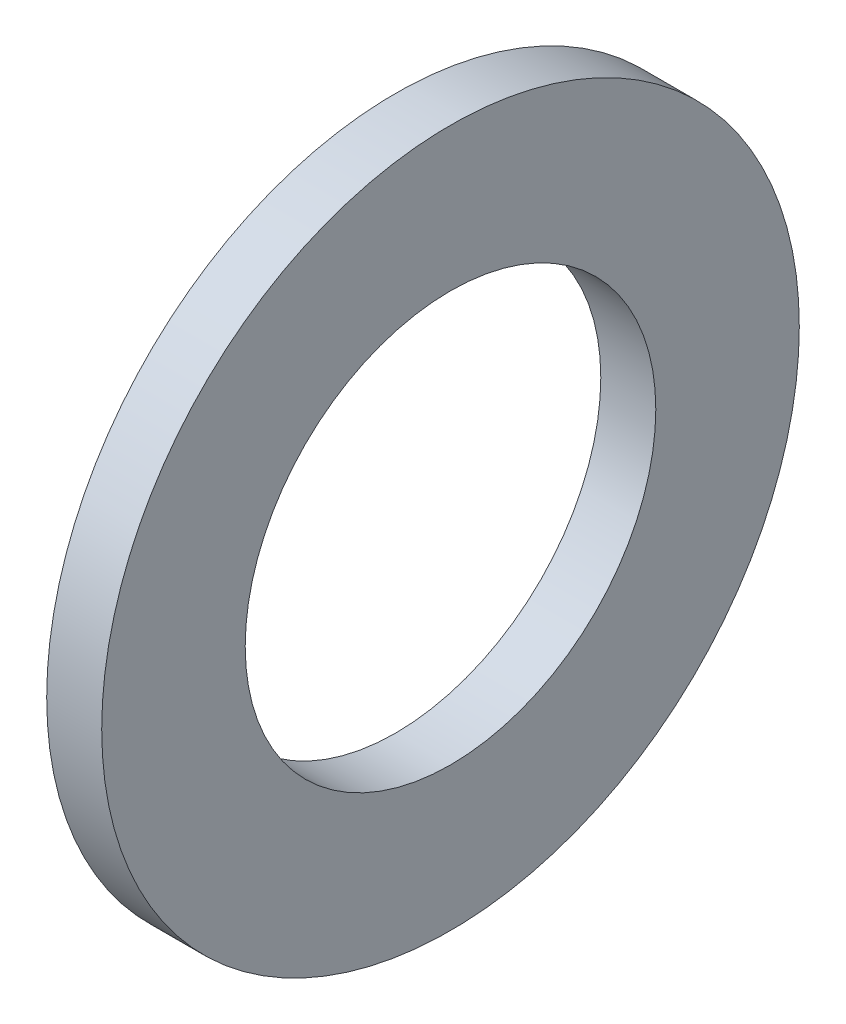
ISO-10303-21;
HEADER;
FILE_DESCRIPTION(('STEP AP214'),'2;1');
FILE_NAME('part.step','',(''),(''),'','','');
FILE_SCHEMA(('AUTOMOTIVE_DESIGN { 1 0 10303 214 1 1 1 1 }'));
ENDSEC;
DATA;
#1=APPLICATION_CONTEXT('core data for automotive mechanical design processes');
#2=APPLICATION_PROTOCOL_DEFINITION('international standard','automotive_design',2000,#1);
#3=PRODUCT_CONTEXT('',#1,'mechanical');
#4=PRODUCT('Part','Part','',(#3));
#5=PRODUCT_RELATED_PRODUCT_CATEGORY('part','',(#4));
#6=PRODUCT_DEFINITION_FORMATION('','',#4);
#7=PRODUCT_DEFINITION_CONTEXT('part definition',#1,'design');
#8=PRODUCT_DEFINITION('design','',#6,#7);
#9=PRODUCT_DEFINITION_SHAPE('','',#8);
#10=(LENGTH_UNIT() NAMED_UNIT(*) SI_UNIT(.MILLI.,.METRE.));
#11=(NAMED_UNIT(*) PLANE_ANGLE_UNIT() SI_UNIT($,.RADIAN.));
#12=(NAMED_UNIT(*) SI_UNIT($,.STERADIAN.) SOLID_ANGLE_UNIT());
#13=UNCERTAINTY_MEASURE_WITH_UNIT(LENGTH_MEASURE(1.E-05),#10,'distance_accuracy_value','');
#14=(GEOMETRIC_REPRESENTATION_CONTEXT(3) GLOBAL_UNCERTAINTY_ASSIGNED_CONTEXT((#13)) GLOBAL_UNIT_ASSIGNED_CONTEXT((#10,
#11,#12)) REPRESENTATION_CONTEXT('',''));
#15=CARTESIAN_POINT('',(0.,0.,0.));
#16=DIRECTION('',(0.,0.,1.));
#17=DIRECTION('',(1.,0.,0.));
#18=AXIS2_PLACEMENT_3D('',#15,#16,#17);
#19=CARTESIAN_POINT('',(1.7526,0.,0.));
#20=DIRECTION('',(1.,0.,0.));
#21=DIRECTION('',(0.,0.,-1.));
#22=AXIS2_PLACEMENT_3D('',#19,#20,#21);
#23=PLANE('',#22);
#24=CARTESIAN_POINT('',(1.7526,0.,0.));
#25=DIRECTION('',(1.,0.,0.));
#26=DIRECTION('',(0.,0.,-1.));
#27=AXIS2_PLACEMENT_3D('',#24,#25,#26);
#28=CIRCLE('',#27,11.1125);
#29=CARTESIAN_POINT('',(1.7526,0.,-11.1125));
#30=VERTEX_POINT('',#29);
#31=EDGE_CURVE('E10',#30,#30,#28,.T.);
#32=ORIENTED_EDGE('',*,*,#31,.T.);
#33=EDGE_LOOP('',(#32));
#34=FACE_BOUND('',#33,.T.);
#35=CARTESIAN_POINT('',(1.7526,0.,0.));
#36=DIRECTION('',(1.,0.,0.));
#37=DIRECTION('',(0.,0.,-1.));
#38=AXIS2_PLACEMENT_3D('',#35,#36,#37);
#39=CIRCLE('',#38,6.5405);
#40=CARTESIAN_POINT('',(1.7526,0.,-6.5405));
#41=VERTEX_POINT('',#40);
#42=EDGE_CURVE('E41',#41,#41,#39,.T.);
#43=ORIENTED_EDGE('',*,*,#42,.F.);
#44=EDGE_LOOP('',(#43));
#45=FACE_BOUND('',#44,.T.);
#46=ADVANCED_FACE('F30',(#34,#45),#23,.T.);
#47=CARTESIAN_POINT('',(0.,0.,0.));
#48=DIRECTION('',(1.,0.,0.));
#49=DIRECTION('',(0.,0.,-1.));
#50=AXIS2_PLACEMENT_3D('',#47,#48,#49);
#51=PLANE('',#50);
#52=CARTESIAN_POINT('',(0.,0.,0.));
#53=DIRECTION('',(1.,0.,0.));
#54=DIRECTION('',(0.,0.,-1.));
#55=AXIS2_PLACEMENT_3D('',#52,#53,#54);
#56=CIRCLE('',#55,11.1125);
#57=CARTESIAN_POINT('',(0.,0.,-11.1125));
#58=VERTEX_POINT('',#57);
#59=EDGE_CURVE('E34',#58,#58,#56,.T.);
#60=ORIENTED_EDGE('',*,*,#59,.F.);
#61=EDGE_LOOP('',(#60));
#62=FACE_BOUND('',#61,.T.);
#63=CARTESIAN_POINT('',(0.,0.,0.));
#64=DIRECTION('',(1.,0.,0.));
#65=DIRECTION('',(0.,0.,-1.));
#66=AXIS2_PLACEMENT_3D('',#63,#64,#65);
#67=CIRCLE('',#66,6.5405);
#68=CARTESIAN_POINT('',(0.,0.,-6.5405));
#69=VERTEX_POINT('',#68);
#70=EDGE_CURVE('E43',#69,#69,#67,.T.);
#71=ORIENTED_EDGE('',*,*,#70,.T.);
#72=EDGE_LOOP('',(#71));
#73=FACE_BOUND('',#72,.T.);
#74=ADVANCED_FACE('F53',(#62,#73),#51,.F.);
#75=CARTESIAN_POINT('',(1.7526,0.,0.));
#76=DIRECTION('',(-1.,0.,0.));
#77=DIRECTION('',(0.,0.,1.));
#78=AXIS2_PLACEMENT_3D('',#75,#76,#77);
#79=CYLINDRICAL_SURFACE('',#78,11.1125);
#80=ORIENTED_EDGE('',*,*,#31,.F.);
#81=EDGE_LOOP('',(#80));
#82=FACE_BOUND('',#81,.T.);
#83=ORIENTED_EDGE('',*,*,#59,.T.);
#84=EDGE_LOOP('',(#83));
#85=FACE_BOUND('',#84,.T.);
#86=ADVANCED_FACE('F32',(#82,#85),#79,.T.);
#87=CARTESIAN_POINT('',(1.7526,0.,0.));
#88=DIRECTION('',(-1.,0.,0.));
#89=DIRECTION('',(0.,0.,1.));
#90=AXIS2_PLACEMENT_3D('',#87,#88,#89);
#91=CYLINDRICAL_SURFACE('',#90,6.5405);
#92=ORIENTED_EDGE('',*,*,#42,.T.);
#93=EDGE_LOOP('',(#92));
#94=FACE_BOUND('',#93,.T.);
#95=ORIENTED_EDGE('',*,*,#70,.F.);
#96=EDGE_LOOP('',(#95));
#97=FACE_BOUND('',#96,.T.);
#98=ADVANCED_FACE('F49',(#94,#97),#91,.F.);
#99=CLOSED_SHELL('',(#46,#74,#86,#98));
#100=MANIFOLD_SOLID_BREP('B2',#99);
#101=ADVANCED_BREP_SHAPE_REPRESENTATION('',(#18,#100),#14);
#102=SHAPE_DEFINITION_REPRESENTATION(#9,#101);
ENDSEC;
END-ISO-10303-21;
